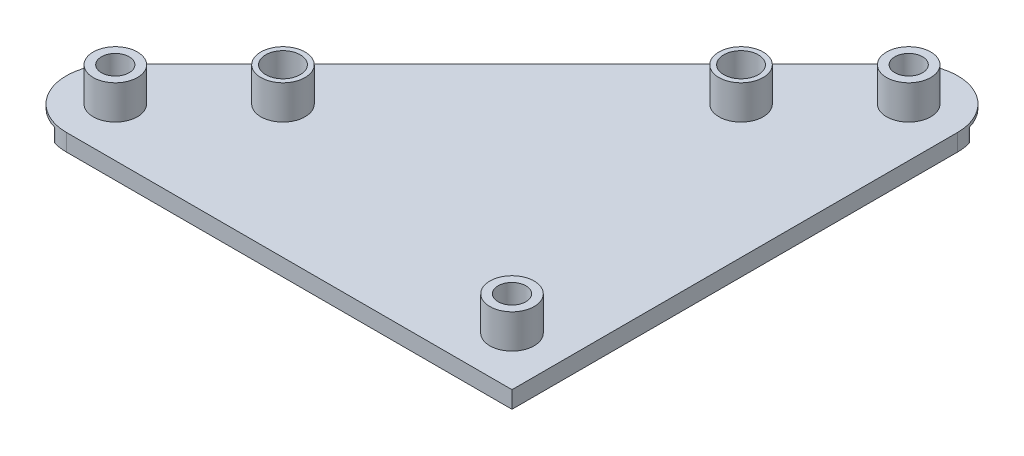
ISO-10303-21;
HEADER;
FILE_DESCRIPTION(('STEP AP214'),'2;1');
FILE_NAME('part.step','',(''),(''),'','','');
FILE_SCHEMA(('AUTOMOTIVE_DESIGN { 1 0 10303 214 1 1 1 1 }'));
ENDSEC;
DATA;
#1=APPLICATION_CONTEXT('core data for automotive mechanical design processes');
#2=APPLICATION_PROTOCOL_DEFINITION('international standard','automotive_design',2000,#1);
#3=PRODUCT_CONTEXT('',#1,'mechanical');
#4=PRODUCT('Part','Part','',(#3));
#5=PRODUCT_RELATED_PRODUCT_CATEGORY('part','',(#4));
#6=PRODUCT_DEFINITION_FORMATION('','',#4);
#7=PRODUCT_DEFINITION_CONTEXT('part definition',#1,'design');
#8=PRODUCT_DEFINITION('design','',#6,#7);
#9=PRODUCT_DEFINITION_SHAPE('','',#8);
#10=(LENGTH_UNIT() NAMED_UNIT(*) SI_UNIT(.MILLI.,.METRE.));
#11=(NAMED_UNIT(*) PLANE_ANGLE_UNIT() SI_UNIT($,.RADIAN.));
#12=(NAMED_UNIT(*) SI_UNIT($,.STERADIAN.) SOLID_ANGLE_UNIT());
#13=UNCERTAINTY_MEASURE_WITH_UNIT(LENGTH_MEASURE(1.E-05),#10,'distance_accuracy_value','');
#14=(GEOMETRIC_REPRESENTATION_CONTEXT(3) GLOBAL_UNCERTAINTY_ASSIGNED_CONTEXT((#13)) GLOBAL_UNIT_ASSIGNED_CONTEXT((#10,
#11,#12)) REPRESENTATION_CONTEXT('',''));
#15=CARTESIAN_POINT('',(0.,0.,0.));
#16=DIRECTION('',(0.,0.,1.));
#17=DIRECTION('',(1.,0.,0.));
#18=AXIS2_PLACEMENT_3D('',#15,#16,#17);
#19=CARTESIAN_POINT('',(0.,1.,0.));
#20=DIRECTION('',(0.,1.,0.));
#21=DIRECTION('',(0.,0.,1.));
#22=AXIS2_PLACEMENT_3D('',#19,#20,#21);
#23=PLANE('',#22);
#24=CARTESIAN_POINT('',(-24.6266321415048,1.,-91.9078423714049));
#25=DIRECTION('',(0.,1.,0.));
#26=DIRECTION('',(0.,0.,1.));
#27=AXIS2_PLACEMENT_3D('',#24,#25,#26);
#28=CIRCLE('',#27,6.5);
#29=CARTESIAN_POINT('',(-24.6266321415048,1.,-85.4078423714049));
#30=VERTEX_POINT('',#29);
#31=EDGE_CURVE('E251',#30,#30,#28,.T.);
#32=ORIENTED_EDGE('',*,*,#31,.F.);
#33=EDGE_LOOP('',(#32));
#34=FACE_BOUND('',#33,.T.);
#35=CARTESIAN_POINT('',(0.,1.,-116.53447451291));
#36=DIRECTION('',(0.,1.,0.));
#37=DIRECTION('',(0.,0.,1.));
#38=AXIS2_PLACEMENT_3D('',#35,#36,#37);
#39=CIRCLE('',#38,6.5);
#40=CARTESIAN_POINT('',(0.,1.,-110.03447451291));
#41=VERTEX_POINT('',#40);
#42=EDGE_CURVE('E233',#41,#41,#39,.T.);
#43=ORIENTED_EDGE('',*,*,#42,.F.);
#44=EDGE_LOOP('',(#43));
#45=FACE_BOUND('',#44,.T.);
#46=DIRECTION('',(0.,0.,-1.));
#47=VECTOR('',#46,1.);
#48=CARTESIAN_POINT('',(14.4,1.,0.));
#49=LINE('',#48,#47);
#50=CARTESIAN_POINT('',(14.4,1.,14.4));
#51=VERTEX_POINT('',#50);
#52=CARTESIAN_POINT('',(14.4,1.,-116.53447451291));
#53=VERTEX_POINT('',#52);
#54=EDGE_CURVE('E156',#51,#53,#49,.T.);
#55=ORIENTED_EDGE('',*,*,#54,.T.);
#56=CARTESIAN_POINT('',(0.,1.,-116.53447451291));
#57=DIRECTION('',(0.,1.,0.));
#58=DIRECTION('',(0.,0.,1.));
#59=AXIS2_PLACEMENT_3D('',#56,#57,#58);
#60=CIRCLE('',#59,14.4);
#61=CARTESIAN_POINT('',(-10.1823376490863,1.,-126.716812161996));
#62=VERTEX_POINT('',#61);
#63=EDGE_CURVE('E159',#53,#62,#60,.T.);
#64=ORIENTED_EDGE('',*,*,#63,.T.);
#65=DIRECTION('',(0.707106781186548,0.,-0.707106781186547));
#66=VECTOR('',#65,1.);
#67=CARTESIAN_POINT('',(-68.4495749055411,1.,-68.4495749055412));
#68=LINE('',#67,#66);
#69=CARTESIAN_POINT('',(-126.716812161996,1.,-10.1823376490863));
#70=VERTEX_POINT('',#69);
#71=EDGE_CURVE('E162',#70,#62,#68,.T.);
#72=ORIENTED_EDGE('',*,*,#71,.F.);
#73=CARTESIAN_POINT('',(-116.53447451291,1.,0.));
#74=DIRECTION('',(0.,1.,0.));
#75=DIRECTION('',(0.,0.,1.));
#76=AXIS2_PLACEMENT_3D('',#73,#74,#75);
#77=CIRCLE('',#76,14.4);
#78=CARTESIAN_POINT('',(-116.53447451291,1.,14.4));
#79=VERTEX_POINT('',#78);
#80=EDGE_CURVE('E165',#79,#70,#77,.F.);
#81=ORIENTED_EDGE('',*,*,#80,.F.);
#82=DIRECTION('',(-1.,0.,0.));
#83=VECTOR('',#82,1.);
#84=CARTESIAN_POINT('',(0.,1.,14.4));
#85=LINE('',#84,#83);
#86=EDGE_CURVE('E168',#51,#79,#85,.T.);
#87=ORIENTED_EDGE('',*,*,#86,.F.);
#88=EDGE_LOOP('',(#55,#64,#72,#81,#87));
#89=FACE_BOUND('',#88,.T.);
#90=CARTESIAN_POINT('',(-116.53447451291,1.,0.));
#91=DIRECTION('',(0.,1.,0.));
#92=DIRECTION('',(0.,0.,1.));
#93=AXIS2_PLACEMENT_3D('',#90,#91,#92);
#94=CIRCLE('',#93,6.5);
#95=CARTESIAN_POINT('',(-116.53447451291,1.,6.5));
#96=VERTEX_POINT('',#95);
#97=EDGE_CURVE('E222',#96,#96,#94,.T.);
#98=ORIENTED_EDGE('',*,*,#97,.F.);
#99=EDGE_LOOP('',(#98));
#100=FACE_BOUND('',#99,.T.);
#101=CARTESIAN_POINT('',(-91.9078423714049,1.,-24.6266321415049));
#102=DIRECTION('',(0.,1.,0.));
#103=DIRECTION('',(0.,0.,1.));
#104=AXIS2_PLACEMENT_3D('',#101,#102,#103);
#105=CIRCLE('',#104,6.5);
#106=CARTESIAN_POINT('',(-91.9078423714049,1.,-18.1266321415049));
#107=VERTEX_POINT('',#106);
#108=EDGE_CURVE('E242',#107,#107,#105,.T.);
#109=ORIENTED_EDGE('',*,*,#108,.F.);
#110=EDGE_LOOP('',(#109));
#111=FACE_BOUND('',#110,.T.);
#112=CARTESIAN_POINT('',(0.,1.,0.));
#113=DIRECTION('',(0.,1.,0.));
#114=DIRECTION('',(0.,0.,1.));
#115=AXIS2_PLACEMENT_3D('',#112,#113,#114);
#116=CIRCLE('',#115,6.5);
#117=CARTESIAN_POINT('',(0.,1.,6.5));
#118=VERTEX_POINT('',#117);
#119=EDGE_CURVE('E260',#118,#118,#116,.T.);
#120=ORIENTED_EDGE('',*,*,#119,.F.);
#121=EDGE_LOOP('',(#120));
#122=FACE_BOUND('',#121,.T.);
#123=ADVANCED_FACE('F42',(#34,#45,#89,#100,#111,#122),#23,.T.);
#124=CARTESIAN_POINT('',(0.,0.,0.));
#125=DIRECTION('',(0.,1.,0.));
#126=DIRECTION('',(0.,0.,1.));
#127=AXIS2_PLACEMENT_3D('',#124,#125,#126);
#128=PLANE('',#127);
#129=CARTESIAN_POINT('',(0.,0.,-116.53447451291));
#130=DIRECTION('',(0.,1.,0.));
#131=DIRECTION('',(0.,0.,1.));
#132=AXIS2_PLACEMENT_3D('',#129,#130,#131);
#133=CIRCLE('',#132,4.075);
#134=CARTESIAN_POINT('',(0.,0.,-112.45947451291));
#135=VERTEX_POINT('',#134);
#136=EDGE_CURVE('E183',#135,#135,#133,.T.);
#137=ORIENTED_EDGE('',*,*,#136,.T.);
#138=EDGE_LOOP('',(#137));
#139=FACE_BOUND('',#138,.T.);
#140=CARTESIAN_POINT('',(-116.53447451291,0.,0.));
#141=DIRECTION('',(0.,1.,0.));
#142=DIRECTION('',(0.,0.,1.));
#143=AXIS2_PLACEMENT_3D('',#140,#141,#142);
#144=CIRCLE('',#143,4.075);
#145=CARTESIAN_POINT('',(-116.53447451291,0.,4.075));
#146=VERTEX_POINT('',#145);
#147=EDGE_CURVE('E180',#146,#146,#144,.T.);
#148=ORIENTED_EDGE('',*,*,#147,.T.);
#149=EDGE_LOOP('',(#148));
#150=FACE_BOUND('',#149,.T.);
#151=CARTESIAN_POINT('',(0.,0.,0.));
#152=DIRECTION('',(0.,1.,0.));
#153=DIRECTION('',(0.,0.,1.));
#154=AXIS2_PLACEMENT_3D('',#151,#152,#153);
#155=CIRCLE('',#154,4.075);
#156=CARTESIAN_POINT('',(0.,0.,4.075));
#157=VERTEX_POINT('',#156);
#158=EDGE_CURVE('E177',#157,#157,#155,.T.);
#159=ORIENTED_EDGE('',*,*,#158,.T.);
#160=EDGE_LOOP('',(#159));
#161=FACE_BOUND('',#160,.T.);
#162=CARTESIAN_POINT('',(-91.9078423714049,0.,-24.6266321415049));
#163=DIRECTION('',(0.,1.,0.));
#164=DIRECTION('',(0.,0.,1.));
#165=AXIS2_PLACEMENT_3D('',#162,#163,#164);
#166=CIRCLE('',#165,5.075);
#167=CARTESIAN_POINT('',(-91.9078423714049,0.,-19.5516321415049));
#168=VERTEX_POINT('',#167);
#169=EDGE_CURVE('E174',#168,#168,#166,.T.);
#170=ORIENTED_EDGE('',*,*,#169,.T.);
#171=EDGE_LOOP('',(#170));
#172=FACE_BOUND('',#171,.T.);
#173=CARTESIAN_POINT('',(-24.6266321415048,0.,-91.9078423714049));
#174=DIRECTION('',(0.,1.,0.));
#175=DIRECTION('',(0.,0.,1.));
#176=AXIS2_PLACEMENT_3D('',#173,#174,#175);
#177=CIRCLE('',#176,5.075);
#178=CARTESIAN_POINT('',(-24.6266321415048,0.,-86.8328423714049));
#179=VERTEX_POINT('',#178);
#180=EDGE_CURVE('E136',#179,#179,#177,.T.);
#181=ORIENTED_EDGE('',*,*,#180,.T.);
#182=EDGE_LOOP('',(#181));
#183=FACE_BOUND('',#182,.T.);
#184=DIRECTION('',(0.,0.,-1.));
#185=VECTOR('',#184,1.);
#186=CARTESIAN_POINT('',(12.4,0.,12.4));
#187=LINE('',#186,#185);
#188=CARTESIAN_POINT('',(12.4,0.,12.4));
#189=VERTEX_POINT('',#188);
#190=CARTESIAN_POINT('',(12.4,0.,-120.195075556454));
#191=VERTEX_POINT('',#190);
#192=EDGE_CURVE('E153',#189,#191,#187,.T.);
#193=ORIENTED_EDGE('',*,*,#192,.F.);
#194=DIRECTION('',(1.,0.,0.));
#195=VECTOR('',#194,1.);
#196=CARTESIAN_POINT('',(12.4,0.,12.4));
#197=LINE('',#196,#195);
#198=CARTESIAN_POINT('',(-120.195075556454,0.,12.4));
#199=VERTEX_POINT('',#198);
#200=EDGE_CURVE('E134',#199,#189,#197,.T.);
#201=ORIENTED_EDGE('',*,*,#200,.F.);
#202=CARTESIAN_POINT('',(-120.195075556454,0.,13.15));
#203=DIRECTION('',(0.,1.,0.));
#204=DIRECTION('',(0.,0.,1.));
#205=AXIS2_PLACEMENT_3D('',#202,#203,#204);
#206=CIRCLE('',#205,0.75);
#207=CARTESIAN_POINT('',(-120.396207481924,0.,13.8725274725275));
#208=VERTEX_POINT('',#207);
#209=EDGE_CURVE('E50',#199,#208,#206,.T.);
#210=ORIENTED_EDGE('',*,*,#209,.T.);
#211=CARTESIAN_POINT('',(-116.53447451291,0.,0.));
#212=DIRECTION('',(0.,1.,0.));
#213=DIRECTION('',(0.,0.,1.));
#214=AXIS2_PLACEMENT_3D('',#211,#212,#213);
#215=CIRCLE('',#214,14.4);
#216=CARTESIAN_POINT('',(-126.716812161996,0.,-10.1823376490863));
#217=VERTEX_POINT('',#216);
#218=EDGE_CURVE('E160',#208,#217,#215,.F.);
#219=ORIENTED_EDGE('',*,*,#218,.T.);
#220=DIRECTION('',(0.707106781186548,0.,-0.707106781186547));
#221=VECTOR('',#220,1.);
#222=CARTESIAN_POINT('',(-68.4495749055411,0.,-68.4495749055412));
#223=LINE('',#222,#221);
#224=CARTESIAN_POINT('',(-10.1823376490863,0.,-126.716812161996));
#225=VERTEX_POINT('',#224);
#226=EDGE_CURVE('E187',#217,#225,#223,.T.);
#227=ORIENTED_EDGE('',*,*,#226,.T.);
#228=CARTESIAN_POINT('',(0.,0.,-116.53447451291));
#229=DIRECTION('',(0.,1.,0.));
#230=DIRECTION('',(0.,0.,1.));
#231=AXIS2_PLACEMENT_3D('',#228,#229,#230);
#232=CIRCLE('',#231,14.4);
#233=CARTESIAN_POINT('',(13.8725274725275,0.,-120.396207481924));
#234=VERTEX_POINT('',#233);
#235=EDGE_CURVE('E60',#234,#225,#232,.T.);
#236=ORIENTED_EDGE('',*,*,#235,.F.);
#237=CARTESIAN_POINT('',(13.15,0.,-120.195075556454));
#238=DIRECTION('',(0.,1.,0.));
#239=DIRECTION('',(0.,0.,1.));
#240=AXIS2_PLACEMENT_3D('',#237,#238,#239);
#241=CIRCLE('',#240,0.75);
#242=EDGE_CURVE('E11',#234,#191,#241,.T.);
#243=ORIENTED_EDGE('',*,*,#242,.T.);
#244=EDGE_LOOP('',(#193,#201,#210,#219,#227,#236,#243));
#245=FACE_BOUND('',#244,.T.);
#246=ADVANCED_FACE('F214',(#139,#150,#161,#172,#183,#245),#128,.F.);
#247=CARTESIAN_POINT('',(14.4,1.,0.));
#248=DIRECTION('',(-1.,0.,0.));
#249=DIRECTION('',(0.,0.,1.));
#250=AXIS2_PLACEMENT_3D('',#247,#248,#249);
#251=PLANE('',#250);
#252=DIRECTION('',(0.,-1.,0.));
#253=VECTOR('',#252,1.);
#254=CARTESIAN_POINT('',(14.4,1.,14.4));
#255=LINE('',#254,#253);
#256=CARTESIAN_POINT('',(14.4,-4.,14.4));
#257=VERTEX_POINT('',#256);
#258=EDGE_CURVE('E171',#51,#257,#255,.T.);
#259=ORIENTED_EDGE('',*,*,#258,.T.);
#260=DIRECTION('',(0.,0.,1.));
#261=VECTOR('',#260,1.);
#262=CARTESIAN_POINT('',(14.4,-4.,-116.53447451291));
#263=LINE('',#262,#261);
#264=CARTESIAN_POINT('',(14.4,-4.,-116.53447451291));
#265=VERTEX_POINT('',#264);
#266=EDGE_CURVE('E144',#265,#257,#263,.T.);
#267=ORIENTED_EDGE('',*,*,#266,.F.);
#268=DIRECTION('',(0.,-1.,0.));
#269=VECTOR('',#268,1.);
#270=CARTESIAN_POINT('',(14.4,1.,-116.53447451291));
#271=LINE('',#270,#269);
#272=EDGE_CURVE('E199',#53,#265,#271,.T.);
#273=ORIENTED_EDGE('',*,*,#272,.F.);
#274=ORIENTED_EDGE('',*,*,#54,.F.);
#275=EDGE_LOOP('',(#259,#267,#273,#274));
#276=FACE_BOUND('',#275,.T.);
#277=ADVANCED_FACE('F277',(#276),#251,.F.);
#278=CARTESIAN_POINT('',(0.,1.,-116.53447451291));
#279=DIRECTION('',(0.,-1.,0.));
#280=DIRECTION('',(0.,0.,-1.));
#281=AXIS2_PLACEMENT_3D('',#278,#279,#280);
#282=CYLINDRICAL_SURFACE('',#281,14.4);
#283=CARTESIAN_POINT('',(0.,-4.,-116.53447451291));
#284=DIRECTION('',(0.,-1.,0.));
#285=DIRECTION('',(0.,0.,-1.));
#286=AXIS2_PLACEMENT_3D('',#283,#284,#285);
#287=CIRCLE('',#286,14.4);
#288=CARTESIAN_POINT('',(13.8725274725275,-4.,-120.396207481924));
#289=VERTEX_POINT('',#288);
#290=EDGE_CURVE('E142',#289,#265,#287,.T.);
#291=ORIENTED_EDGE('',*,*,#290,.F.);
#292=DIRECTION('',(0.,-1.,0.));
#293=VECTOR('',#292,1.);
#294=CARTESIAN_POINT('',(13.8725274725275,1.,-120.396207481924));
#295=LINE('',#294,#293);
#296=EDGE_CURVE('E209',#289,#234,#295,.F.);
#297=ORIENTED_EDGE('',*,*,#296,.T.);
#298=ORIENTED_EDGE('',*,*,#235,.T.);
#299=DIRECTION('',(0.,-1.,0.));
#300=VECTOR('',#299,1.);
#301=CARTESIAN_POINT('',(-10.1823376490863,1.,-126.716812161996));
#302=LINE('',#301,#300);
#303=EDGE_CURVE('E196',#62,#225,#302,.T.);
#304=ORIENTED_EDGE('',*,*,#303,.F.);
#305=ORIENTED_EDGE('',*,*,#63,.F.);
#306=ORIENTED_EDGE('',*,*,#272,.T.);
#307=EDGE_LOOP('',(#291,#297,#298,#304,#305,#306));
#308=FACE_BOUND('',#307,.T.);
#309=ADVANCED_FACE('F296',(#308),#282,.T.);
#310=CARTESIAN_POINT('',(-68.4495749055411,1.,-68.4495749055412));
#311=DIRECTION('',(-0.707106781186547,0.,-0.707106781186548));
#312=DIRECTION('',(-0.707106781186548,0.,0.707106781186547));
#313=AXIS2_PLACEMENT_3D('',#310,#311,#312);
#314=PLANE('',#313);
#315=ORIENTED_EDGE('',*,*,#226,.F.);
#316=DIRECTION('',(0.,-1.,0.));
#317=VECTOR('',#316,1.);
#318=CARTESIAN_POINT('',(-126.716812161996,1.,-10.1823376490863));
#319=LINE('',#318,#317);
#320=EDGE_CURVE('E193',#70,#217,#319,.T.);
#321=ORIENTED_EDGE('',*,*,#320,.F.);
#322=ORIENTED_EDGE('',*,*,#71,.T.);
#323=ORIENTED_EDGE('',*,*,#303,.T.);
#324=EDGE_LOOP('',(#315,#321,#322,#323));
#325=FACE_BOUND('',#324,.T.);
#326=ADVANCED_FACE('F293',(#325),#314,.T.);
#327=CARTESIAN_POINT('',(-116.53447451291,1.,0.));
#328=DIRECTION('',(0.,-1.,0.));
#329=DIRECTION('',(0.,0.,-1.));
#330=AXIS2_PLACEMENT_3D('',#327,#328,#329);
#331=CYLINDRICAL_SURFACE('',#330,14.4);
#332=ORIENTED_EDGE('',*,*,#218,.F.);
#333=DIRECTION('',(0.,-1.,0.));
#334=VECTOR('',#333,1.);
#335=CARTESIAN_POINT('',(-120.396207481924,1.,13.8725274725275));
#336=LINE('',#335,#334);
#337=CARTESIAN_POINT('',(-120.396207481924,-4.,13.8725274725275));
#338=VERTEX_POINT('',#337);
#339=EDGE_CURVE('E204',#208,#338,#336,.T.);
#340=ORIENTED_EDGE('',*,*,#339,.T.);
#341=CARTESIAN_POINT('',(-116.53447451291,-4.,0.));
#342=DIRECTION('',(0.,-1.,0.));
#343=DIRECTION('',(0.,0.,-1.));
#344=AXIS2_PLACEMENT_3D('',#341,#342,#343);
#345=CIRCLE('',#344,14.4);
#346=CARTESIAN_POINT('',(-116.53447451291,-4.,14.4));
#347=VERTEX_POINT('',#346);
#348=EDGE_CURVE('E128',#347,#338,#345,.T.);
#349=ORIENTED_EDGE('',*,*,#348,.F.);
#350=DIRECTION('',(0.,-1.,0.));
#351=VECTOR('',#350,1.);
#352=CARTESIAN_POINT('',(-116.53447451291,1.,14.4));
#353=LINE('',#352,#351);
#354=EDGE_CURVE('E191',#79,#347,#353,.T.);
#355=ORIENTED_EDGE('',*,*,#354,.F.);
#356=ORIENTED_EDGE('',*,*,#80,.T.);
#357=ORIENTED_EDGE('',*,*,#320,.T.);
#358=EDGE_LOOP('',(#332,#340,#349,#355,#356,#357));
#359=FACE_BOUND('',#358,.T.);
#360=ADVANCED_FACE('F219',(#359),#331,.T.);
#361=CARTESIAN_POINT('',(0.,1.,-116.53447451291));
#362=DIRECTION('',(0.,-1.,0.));
#363=DIRECTION('',(0.,0.,-1.));
#364=AXIS2_PLACEMENT_3D('',#361,#362,#363);
#365=CYLINDRICAL_SURFACE('',#364,4.075);
#366=ORIENTED_EDGE('',*,*,#136,.F.);
#367=EDGE_LOOP('',(#366));
#368=FACE_BOUND('',#367,.T.);
#369=CARTESIAN_POINT('',(0.,11.,-116.53447451291));
#370=DIRECTION('',(0.,1.,0.));
#371=DIRECTION('',(0.,0.,1.));
#372=AXIS2_PLACEMENT_3D('',#369,#370,#371);
#373=CIRCLE('',#372,4.07499999999999);
#374=CARTESIAN_POINT('',(0.,11.,-112.45947451291));
#375=VERTEX_POINT('',#374);
#376=EDGE_CURVE('E230',#375,#375,#373,.T.);
#377=ORIENTED_EDGE('',*,*,#376,.T.);
#378=EDGE_LOOP('',(#377));
#379=FACE_BOUND('',#378,.T.);
#380=ADVANCED_FACE('F292',(#368,#379),#365,.F.);
#381=CARTESIAN_POINT('',(-116.53447451291,1.,0.));
#382=DIRECTION('',(0.,-1.,0.));
#383=DIRECTION('',(0.,0.,-1.));
#384=AXIS2_PLACEMENT_3D('',#381,#382,#383);
#385=CYLINDRICAL_SURFACE('',#384,4.075);
#386=ORIENTED_EDGE('',*,*,#147,.F.);
#387=EDGE_LOOP('',(#386));
#388=FACE_BOUND('',#387,.T.);
#389=CARTESIAN_POINT('',(-116.53447451291,11.,0.));
#390=DIRECTION('',(0.,1.,0.));
#391=DIRECTION('',(0.,0.,1.));
#392=AXIS2_PLACEMENT_3D('',#389,#390,#391);
#393=CIRCLE('',#392,4.075);
#394=CARTESIAN_POINT('',(-116.53447451291,11.,4.075));
#395=VERTEX_POINT('',#394);
#396=EDGE_CURVE('E225',#395,#395,#393,.T.);
#397=ORIENTED_EDGE('',*,*,#396,.T.);
#398=EDGE_LOOP('',(#397));
#399=FACE_BOUND('',#398,.T.);
#400=ADVANCED_FACE('F305',(#388,#399),#385,.F.);
#401=CARTESIAN_POINT('',(0.,1.,0.));
#402=DIRECTION('',(0.,-1.,0.));
#403=DIRECTION('',(0.,0.,-1.));
#404=AXIS2_PLACEMENT_3D('',#401,#402,#403);
#405=CYLINDRICAL_SURFACE('',#404,4.075);
#406=ORIENTED_EDGE('',*,*,#158,.F.);
#407=EDGE_LOOP('',(#406));
#408=FACE_BOUND('',#407,.T.);
#409=CARTESIAN_POINT('',(0.,11.,0.));
#410=DIRECTION('',(0.,1.,0.));
#411=DIRECTION('',(0.,0.,1.));
#412=AXIS2_PLACEMENT_3D('',#409,#410,#411);
#413=CIRCLE('',#412,4.075);
#414=CARTESIAN_POINT('',(0.,11.,4.075));
#415=VERTEX_POINT('',#414);
#416=EDGE_CURVE('E255',#415,#415,#413,.T.);
#417=ORIENTED_EDGE('',*,*,#416,.T.);
#418=EDGE_LOOP('',(#417));
#419=FACE_BOUND('',#418,.T.);
#420=ADVANCED_FACE('F309',(#408,#419),#405,.F.);
#421=CARTESIAN_POINT('',(-91.9078423714049,1.,-24.6266321415049));
#422=DIRECTION('',(0.,-1.,0.));
#423=DIRECTION('',(0.,0.,-1.));
#424=AXIS2_PLACEMENT_3D('',#421,#422,#423);
#425=CYLINDRICAL_SURFACE('',#424,5.075);
#426=ORIENTED_EDGE('',*,*,#169,.F.);
#427=EDGE_LOOP('',(#426));
#428=FACE_BOUND('',#427,.T.);
#429=CARTESIAN_POINT('',(-91.9078423714049,11.,-24.6266321415049));
#430=DIRECTION('',(0.,1.,0.));
#431=DIRECTION('',(0.,0.,1.));
#432=AXIS2_PLACEMENT_3D('',#429,#430,#431);
#433=CIRCLE('',#432,5.075);
#434=CARTESIAN_POINT('',(-91.9078423714049,11.,-19.5516321415049));
#435=VERTEX_POINT('',#434);
#436=EDGE_CURVE('E237',#435,#435,#433,.T.);
#437=ORIENTED_EDGE('',*,*,#436,.T.);
#438=EDGE_LOOP('',(#437));
#439=FACE_BOUND('',#438,.T.);
#440=ADVANCED_FACE('F313',(#428,#439),#425,.F.);
#441=CARTESIAN_POINT('',(-24.6266321415048,1.,-91.9078423714049));
#442=DIRECTION('',(0.,-1.,0.));
#443=DIRECTION('',(0.,0.,-1.));
#444=AXIS2_PLACEMENT_3D('',#441,#442,#443);
#445=CYLINDRICAL_SURFACE('',#444,5.075);
#446=ORIENTED_EDGE('',*,*,#180,.F.);
#447=EDGE_LOOP('',(#446));
#448=FACE_BOUND('',#447,.T.);
#449=CARTESIAN_POINT('',(-24.6266321415048,11.,-91.9078423714049));
#450=DIRECTION('',(0.,1.,0.));
#451=DIRECTION('',(0.,0.,1.));
#452=AXIS2_PLACEMENT_3D('',#449,#450,#451);
#453=CIRCLE('',#452,5.075);
#454=CARTESIAN_POINT('',(-24.6266321415048,11.,-86.8328423714049));
#455=VERTEX_POINT('',#454);
#456=EDGE_CURVE('E246',#455,#455,#453,.T.);
#457=ORIENTED_EDGE('',*,*,#456,.T.);
#458=EDGE_LOOP('',(#457));
#459=FACE_BOUND('',#458,.T.);
#460=ADVANCED_FACE('F288',(#448,#459),#445,.F.);
#461=CARTESIAN_POINT('',(0.,1.,14.4));
#462=DIRECTION('',(0.,0.,1.));
#463=DIRECTION('',(1.,0.,0.));
#464=AXIS2_PLACEMENT_3D('',#461,#462,#463);
#465=PLANE('',#464);
#466=ORIENTED_EDGE('',*,*,#354,.T.);
#467=DIRECTION('',(-1.,0.,0.));
#468=VECTOR('',#467,1.);
#469=CARTESIAN_POINT('',(14.4,-4.,14.4));
#470=LINE('',#469,#468);
#471=EDGE_CURVE('E137',#257,#347,#470,.T.);
#472=ORIENTED_EDGE('',*,*,#471,.F.);
#473=ORIENTED_EDGE('',*,*,#258,.F.);
#474=ORIENTED_EDGE('',*,*,#86,.T.);
#475=EDGE_LOOP('',(#466,#472,#473,#474));
#476=FACE_BOUND('',#475,.T.);
#477=ADVANCED_FACE('F285',(#476),#465,.T.);
#478=CARTESIAN_POINT('',(12.4,-4.,12.4));
#479=DIRECTION('',(0.,0.,1.));
#480=DIRECTION('',(1.,0.,0.));
#481=AXIS2_PLACEMENT_3D('',#478,#479,#480);
#482=PLANE('',#481);
#483=DIRECTION('',(1.,0.,0.));
#484=VECTOR('',#483,1.);
#485=CARTESIAN_POINT('',(12.4,-4.,12.4));
#486=LINE('',#485,#484);
#487=CARTESIAN_POINT('',(-120.195075556454,-4.,12.4));
#488=VERTEX_POINT('',#487);
#489=CARTESIAN_POINT('',(12.4,-4.,12.4));
#490=VERTEX_POINT('',#489);
#491=EDGE_CURVE('E116',#488,#490,#486,.T.);
#492=ORIENTED_EDGE('',*,*,#491,.F.);
#493=DIRECTION('',(0.,1.,0.));
#494=VECTOR('',#493,1.);
#495=CARTESIAN_POINT('',(-120.195075556454,0.,12.4));
#496=LINE('',#495,#494);
#497=EDGE_CURVE('E202',#488,#199,#496,.T.);
#498=ORIENTED_EDGE('',*,*,#497,.T.);
#499=ORIENTED_EDGE('',*,*,#200,.T.);
#500=DIRECTION('',(0.,1.,0.));
#501=VECTOR('',#500,1.);
#502=CARTESIAN_POINT('',(12.4,-4.,12.4));
#503=LINE('',#502,#501);
#504=EDGE_CURVE('E131',#490,#189,#503,.T.);
#505=ORIENTED_EDGE('',*,*,#504,.F.);
#506=EDGE_LOOP('',(#492,#498,#499,#505));
#507=FACE_BOUND('',#506,.T.);
#508=ADVANCED_FACE('F132',(#507),#482,.F.);
#509=CARTESIAN_POINT('',(12.4,-4.,12.4));
#510=DIRECTION('',(1.,0.,0.));
#511=DIRECTION('',(0.,0.,-1.));
#512=AXIS2_PLACEMENT_3D('',#509,#510,#511);
#513=PLANE('',#512);
#514=ORIENTED_EDGE('',*,*,#192,.T.);
#515=DIRECTION('',(0.,-1.,0.));
#516=VECTOR('',#515,1.);
#517=CARTESIAN_POINT('',(12.4,-4.,-120.195075556454));
#518=LINE('',#517,#516);
#519=CARTESIAN_POINT('',(12.4,-4.,-120.195075556454));
#520=VERTEX_POINT('',#519);
#521=EDGE_CURVE('E141',#191,#520,#518,.T.);
#522=ORIENTED_EDGE('',*,*,#521,.T.);
#523=DIRECTION('',(0.,0.,-1.));
#524=VECTOR('',#523,1.);
#525=CARTESIAN_POINT('',(12.4,-4.,12.4));
#526=LINE('',#525,#524);
#527=EDGE_CURVE('E121',#490,#520,#526,.T.);
#528=ORIENTED_EDGE('',*,*,#527,.F.);
#529=ORIENTED_EDGE('',*,*,#504,.T.);
#530=EDGE_LOOP('',(#514,#522,#528,#529));
#531=FACE_BOUND('',#530,.T.);
#532=ADVANCED_FACE('F139',(#531),#513,.F.);
#533=CARTESIAN_POINT('',(-116.53447451291,-4.,0.));
#534=DIRECTION('',(0.,-1.,0.));
#535=DIRECTION('',(0.,0.,-1.));
#536=AXIS2_PLACEMENT_3D('',#533,#534,#535);
#537=PLANE('',#536);
#538=ORIENTED_EDGE('',*,*,#348,.T.);
#539=CARTESIAN_POINT('',(-120.195075556454,-4.,13.15));
#540=DIRECTION('',(0.,-1.,0.));
#541=DIRECTION('',(0.,0.,-1.));
#542=AXIS2_PLACEMENT_3D('',#539,#540,#541);
#543=CIRCLE('',#542,0.75);
#544=EDGE_CURVE('E124',#338,#488,#543,.T.);
#545=ORIENTED_EDGE('',*,*,#544,.T.);
#546=ORIENTED_EDGE('',*,*,#491,.T.);
#547=ORIENTED_EDGE('',*,*,#527,.T.);
#548=CARTESIAN_POINT('',(13.15,-4.,-120.195075556454));
#549=DIRECTION('',(0.,-1.,0.));
#550=DIRECTION('',(0.,0.,-1.));
#551=AXIS2_PLACEMENT_3D('',#548,#549,#550);
#552=CIRCLE('',#551,0.75);
#553=EDGE_CURVE('E206',#520,#289,#552,.T.);
#554=ORIENTED_EDGE('',*,*,#553,.T.);
#555=ORIENTED_EDGE('',*,*,#290,.T.);
#556=ORIENTED_EDGE('',*,*,#266,.T.);
#557=ORIENTED_EDGE('',*,*,#471,.T.);
#558=EDGE_LOOP('',(#538,#545,#546,#547,#554,#555,#556,#557));
#559=FACE_BOUND('',#558,.T.);
#560=ADVANCED_FACE('F119',(#559),#537,.T.);
#561=CARTESIAN_POINT('',(-120.195075556454,1.,13.15));
#562=DIRECTION('',(0.,-1.,0.));
#563=DIRECTION('',(0.,0.,-1.));
#564=AXIS2_PLACEMENT_3D('',#561,#562,#563);
#565=CYLINDRICAL_SURFACE('',#564,0.75);
#566=ORIENTED_EDGE('',*,*,#544,.F.);
#567=ORIENTED_EDGE('',*,*,#339,.F.);
#568=ORIENTED_EDGE('',*,*,#209,.F.);
#569=ORIENTED_EDGE('',*,*,#497,.F.);
#570=EDGE_LOOP('',(#566,#567,#568,#569));
#571=FACE_BOUND('',#570,.T.);
#572=ADVANCED_FACE('F216',(#571),#565,.T.);
#573=CARTESIAN_POINT('',(13.15,1.,-120.195075556454));
#574=DIRECTION('',(0.,-1.,0.));
#575=DIRECTION('',(0.,0.,-1.));
#576=AXIS2_PLACEMENT_3D('',#573,#574,#575);
#577=CYLINDRICAL_SURFACE('',#576,0.75);
#578=ORIENTED_EDGE('',*,*,#553,.F.);
#579=ORIENTED_EDGE('',*,*,#521,.F.);
#580=ORIENTED_EDGE('',*,*,#242,.F.);
#581=ORIENTED_EDGE('',*,*,#296,.F.);
#582=EDGE_LOOP('',(#578,#579,#580,#581));
#583=FACE_BOUND('',#582,.T.);
#584=ADVANCED_FACE('F44',(#583),#577,.T.);
#585=CARTESIAN_POINT('',(-116.53447451291,11.,0.));
#586=DIRECTION('',(0.,1.,0.));
#587=DIRECTION('',(0.,0.,1.));
#588=AXIS2_PLACEMENT_3D('',#585,#586,#587);
#589=PLANE('',#588);
#590=CARTESIAN_POINT('',(-116.53447451291,11.,0.));
#591=DIRECTION('',(0.,1.,0.));
#592=DIRECTION('',(0.,0.,1.));
#593=AXIS2_PLACEMENT_3D('',#590,#591,#592);
#594=CIRCLE('',#593,6.5);
#595=CARTESIAN_POINT('',(-116.53447451291,11.,6.5));
#596=VERTEX_POINT('',#595);
#597=EDGE_CURVE('E154',#596,#596,#594,.T.);
#598=ORIENTED_EDGE('',*,*,#597,.T.);
#599=EDGE_LOOP('',(#598));
#600=FACE_BOUND('',#599,.T.);
#601=ORIENTED_EDGE('',*,*,#396,.F.);
#602=EDGE_LOOP('',(#601));
#603=FACE_BOUND('',#602,.T.);
#604=ADVANCED_FACE('F324',(#600,#603),#589,.T.);
#605=CARTESIAN_POINT('',(-116.53447451291,11.,0.));
#606=DIRECTION('',(0.,-1.,0.));
#607=DIRECTION('',(0.,0.,-1.));
#608=AXIS2_PLACEMENT_3D('',#605,#606,#607);
#609=CYLINDRICAL_SURFACE('',#608,6.5);
#610=ORIENTED_EDGE('',*,*,#597,.F.);
#611=EDGE_LOOP('',(#610));
#612=FACE_BOUND('',#611,.T.);
#613=ORIENTED_EDGE('',*,*,#97,.T.);
#614=EDGE_LOOP('',(#613));
#615=FACE_BOUND('',#614,.T.);
#616=ADVANCED_FACE('F331',(#612,#615),#609,.T.);
#617=CARTESIAN_POINT('',(0.,11.,-116.53447451291));
#618=DIRECTION('',(0.,1.,0.));
#619=DIRECTION('',(0.,0.,1.));
#620=AXIS2_PLACEMENT_3D('',#617,#618,#619);
#621=PLANE('',#620);
#622=CARTESIAN_POINT('',(0.,11.,-116.53447451291));
#623=DIRECTION('',(0.,1.,0.));
#624=DIRECTION('',(0.,0.,1.));
#625=AXIS2_PLACEMENT_3D('',#622,#623,#624);
#626=CIRCLE('',#625,6.5);
#627=CARTESIAN_POINT('',(0.,11.,-110.03447451291));
#628=VERTEX_POINT('',#627);
#629=EDGE_CURVE('E234',#628,#628,#626,.T.);
#630=ORIENTED_EDGE('',*,*,#629,.T.);
#631=EDGE_LOOP('',(#630));
#632=FACE_BOUND('',#631,.T.);
#633=ORIENTED_EDGE('',*,*,#376,.F.);
#634=EDGE_LOOP('',(#633));
#635=FACE_BOUND('',#634,.T.);
#636=ADVANCED_FACE('F334',(#632,#635),#621,.T.);
#637=CARTESIAN_POINT('',(0.,11.,-116.53447451291));
#638=DIRECTION('',(0.,-1.,0.));
#639=DIRECTION('',(0.,0.,-1.));
#640=AXIS2_PLACEMENT_3D('',#637,#638,#639);
#641=CYLINDRICAL_SURFACE('',#640,6.5);
#642=ORIENTED_EDGE('',*,*,#629,.F.);
#643=EDGE_LOOP('',(#642));
#644=FACE_BOUND('',#643,.T.);
#645=ORIENTED_EDGE('',*,*,#42,.T.);
#646=EDGE_LOOP('',(#645));
#647=FACE_BOUND('',#646,.T.);
#648=ADVANCED_FACE('F341',(#644,#647),#641,.T.);
#649=CARTESIAN_POINT('',(-91.9078423714049,11.,-24.6266321415049));
#650=DIRECTION('',(0.,1.,0.));
#651=DIRECTION('',(0.,0.,1.));
#652=AXIS2_PLACEMENT_3D('',#649,#650,#651);
#653=PLANE('',#652);
#654=CARTESIAN_POINT('',(-91.9078423714049,11.,-24.6266321415049));
#655=DIRECTION('',(0.,1.,0.));
#656=DIRECTION('',(0.,0.,1.));
#657=AXIS2_PLACEMENT_3D('',#654,#655,#656);
#658=CIRCLE('',#657,6.5);
#659=CARTESIAN_POINT('',(-91.9078423714049,11.,-18.1266321415049));
#660=VERTEX_POINT('',#659);
#661=EDGE_CURVE('E243',#660,#660,#658,.T.);
#662=ORIENTED_EDGE('',*,*,#661,.T.);
#663=EDGE_LOOP('',(#662));
#664=FACE_BOUND('',#663,.T.);
#665=ORIENTED_EDGE('',*,*,#436,.F.);
#666=EDGE_LOOP('',(#665));
#667=FACE_BOUND('',#666,.T.);
#668=ADVANCED_FACE('F345',(#664,#667),#653,.T.);
#669=CARTESIAN_POINT('',(-91.9078423714049,11.,-24.6266321415049));
#670=DIRECTION('',(0.,-1.,0.));
#671=DIRECTION('',(0.,0.,-1.));
#672=AXIS2_PLACEMENT_3D('',#669,#670,#671);
#673=CYLINDRICAL_SURFACE('',#672,6.5);
#674=ORIENTED_EDGE('',*,*,#661,.F.);
#675=EDGE_LOOP('',(#674));
#676=FACE_BOUND('',#675,.T.);
#677=ORIENTED_EDGE('',*,*,#108,.T.);
#678=EDGE_LOOP('',(#677));
#679=FACE_BOUND('',#678,.T.);
#680=ADVANCED_FACE('F349',(#676,#679),#673,.T.);
#681=CARTESIAN_POINT('',(-24.6266321415048,11.,-91.9078423714049));
#682=DIRECTION('',(0.,1.,0.));
#683=DIRECTION('',(0.,0.,1.));
#684=AXIS2_PLACEMENT_3D('',#681,#682,#683);
#685=PLANE('',#684);
#686=CARTESIAN_POINT('',(-24.6266321415048,11.,-91.9078423714049));
#687=DIRECTION('',(0.,1.,0.));
#688=DIRECTION('',(0.,0.,1.));
#689=AXIS2_PLACEMENT_3D('',#686,#687,#688);
#690=CIRCLE('',#689,6.5);
#691=CARTESIAN_POINT('',(-24.6266321415048,11.,-85.4078423714049));
#692=VERTEX_POINT('',#691);
#693=EDGE_CURVE('E252',#692,#692,#690,.T.);
#694=ORIENTED_EDGE('',*,*,#693,.T.);
#695=EDGE_LOOP('',(#694));
#696=FACE_BOUND('',#695,.T.);
#697=ORIENTED_EDGE('',*,*,#456,.F.);
#698=EDGE_LOOP('',(#697));
#699=FACE_BOUND('',#698,.T.);
#700=ADVANCED_FACE('F353',(#696,#699),#685,.T.);
#701=CARTESIAN_POINT('',(-24.6266321415048,11.,-91.9078423714049));
#702=DIRECTION('',(0.,-1.,0.));
#703=DIRECTION('',(0.,0.,-1.));
#704=AXIS2_PLACEMENT_3D('',#701,#702,#703);
#705=CYLINDRICAL_SURFACE('',#704,6.5);
#706=ORIENTED_EDGE('',*,*,#693,.F.);
#707=EDGE_LOOP('',(#706));
#708=FACE_BOUND('',#707,.T.);
#709=ORIENTED_EDGE('',*,*,#31,.T.);
#710=EDGE_LOOP('',(#709));
#711=FACE_BOUND('',#710,.T.);
#712=ADVANCED_FACE('F357',(#708,#711),#705,.T.);
#713=CARTESIAN_POINT('',(0.,11.,0.));
#714=DIRECTION('',(0.,1.,0.));
#715=DIRECTION('',(0.,0.,1.));
#716=AXIS2_PLACEMENT_3D('',#713,#714,#715);
#717=PLANE('',#716);
#718=CARTESIAN_POINT('',(0.,11.,0.));
#719=DIRECTION('',(0.,1.,0.));
#720=DIRECTION('',(0.,0.,1.));
#721=AXIS2_PLACEMENT_3D('',#718,#719,#720);
#722=CIRCLE('',#721,6.5);
#723=CARTESIAN_POINT('',(0.,11.,6.5));
#724=VERTEX_POINT('',#723);
#725=EDGE_CURVE('E261',#724,#724,#722,.T.);
#726=ORIENTED_EDGE('',*,*,#725,.T.);
#727=EDGE_LOOP('',(#726));
#728=FACE_BOUND('',#727,.T.);
#729=ORIENTED_EDGE('',*,*,#416,.F.);
#730=EDGE_LOOP('',(#729));
#731=FACE_BOUND('',#730,.T.);
#732=ADVANCED_FACE('F361',(#728,#731),#717,.T.);
#733=CARTESIAN_POINT('',(0.,11.,0.));
#734=DIRECTION('',(0.,-1.,0.));
#735=DIRECTION('',(0.,0.,-1.));
#736=AXIS2_PLACEMENT_3D('',#733,#734,#735);
#737=CYLINDRICAL_SURFACE('',#736,6.5);
#738=ORIENTED_EDGE('',*,*,#725,.F.);
#739=EDGE_LOOP('',(#738));
#740=FACE_BOUND('',#739,.T.);
#741=ORIENTED_EDGE('',*,*,#119,.T.);
#742=EDGE_LOOP('',(#741));
#743=FACE_BOUND('',#742,.T.);
#744=ADVANCED_FACE('F267',(#740,#743),#737,.T.);
#745=CLOSED_SHELL('',(#123,#246,#277,#309,#326,#360,#380,#400,#420,#440,#460,#477,#508,#532,
#560,#572,#584,#604,#616,#636,#648,#668,#680,#700,#712,#732,#744));
#746=MANIFOLD_SOLID_BREP('B2',#745);
#747=ADVANCED_BREP_SHAPE_REPRESENTATION('',(#18,#746),#14);
#748=SHAPE_DEFINITION_REPRESENTATION(#9,#747);
ENDSEC;
END-ISO-10303-21;
